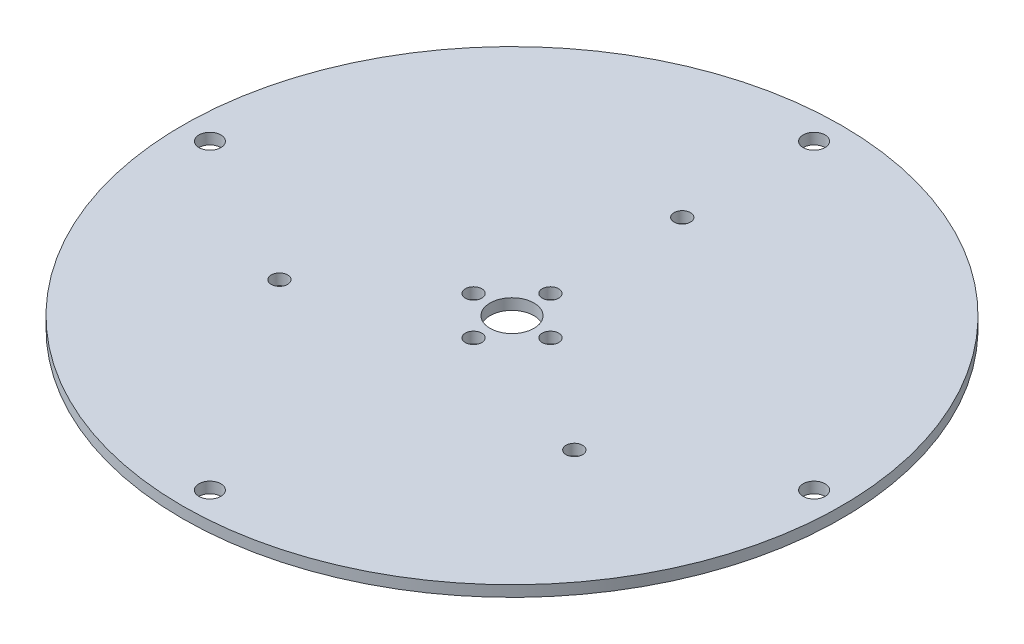
ISO-10303-21;
HEADER;
FILE_DESCRIPTION(('STEP AP214'),'2;1');
FILE_NAME('part.step','',(''),(''),'','','');
FILE_SCHEMA(('AUTOMOTIVE_DESIGN { 1 0 10303 214 1 1 1 1 }'));
ENDSEC;
DATA;
#1=APPLICATION_CONTEXT('core data for automotive mechanical design processes');
#2=APPLICATION_PROTOCOL_DEFINITION('international standard','automotive_design',2000,#1);
#3=PRODUCT_CONTEXT('',#1,'mechanical');
#4=PRODUCT('Part','Part','',(#3));
#5=PRODUCT_RELATED_PRODUCT_CATEGORY('part','',(#4));
#6=PRODUCT_DEFINITION_FORMATION('','',#4);
#7=PRODUCT_DEFINITION_CONTEXT('part definition',#1,'design');
#8=PRODUCT_DEFINITION('design','',#6,#7);
#9=PRODUCT_DEFINITION_SHAPE('','',#8);
#10=(LENGTH_UNIT() NAMED_UNIT(*) SI_UNIT(.MILLI.,.METRE.));
#11=(NAMED_UNIT(*) PLANE_ANGLE_UNIT() SI_UNIT($,.RADIAN.));
#12=(NAMED_UNIT(*) SI_UNIT($,.STERADIAN.) SOLID_ANGLE_UNIT());
#13=UNCERTAINTY_MEASURE_WITH_UNIT(LENGTH_MEASURE(1.E-05),#10,'distance_accuracy_value','');
#14=(GEOMETRIC_REPRESENTATION_CONTEXT(3) GLOBAL_UNCERTAINTY_ASSIGNED_CONTEXT((#13)) GLOBAL_UNIT_ASSIGNED_CONTEXT((#10,
#11,#12)) REPRESENTATION_CONTEXT('',''));
#15=CARTESIAN_POINT('',(0.,0.,0.));
#16=DIRECTION('',(0.,0.,1.));
#17=DIRECTION('',(1.,0.,0.));
#18=AXIS2_PLACEMENT_3D('',#15,#16,#17);
#19=CARTESIAN_POINT('',(0.,2.,0.));
#20=DIRECTION('',(0.,1.,0.));
#21=DIRECTION('',(0.,0.,1.));
#22=AXIS2_PLACEMENT_3D('',#19,#20,#21);
#23=PLANE('',#22);
#24=CARTESIAN_POINT('',(0.,2.,-55.));
#25=DIRECTION('',(0.,1.,0.));
#26=DIRECTION('',(0.,0.,1.));
#27=AXIS2_PLACEMENT_3D('',#24,#25,#26);
#28=CIRCLE('',#27,2.);
#29=CARTESIAN_POINT('',(0.,2.,-53.));
#30=VERTEX_POINT('',#29);
#31=EDGE_CURVE('E62',#30,#30,#28,.T.);
#32=ORIENTED_EDGE('',*,*,#31,.F.);
#33=EDGE_LOOP('',(#32));
#34=FACE_BOUND('',#33,.T.);
#35=CARTESIAN_POINT('',(55.0000000000016,2.,-1.55309068257925E-12));
#36=DIRECTION('',(0.,1.,0.));
#37=DIRECTION('',(0.,0.,1.));
#38=AXIS2_PLACEMENT_3D('',#35,#36,#37);
#39=CIRCLE('',#38,2.00000000000121);
#40=CARTESIAN_POINT('',(55.0000000000016,2.,1.99999999999966));
#41=VERTEX_POINT('',#40);
#42=EDGE_CURVE('E163',#41,#41,#39,.T.);
#43=ORIENTED_EDGE('',*,*,#42,.F.);
#44=EDGE_LOOP('',(#43));
#45=FACE_BOUND('',#44,.T.);
#46=CARTESIAN_POINT('',(3.10618136515851E-12,2.,55.));
#47=DIRECTION('',(0.,1.,0.));
#48=DIRECTION('',(0.,0.,1.));
#49=AXIS2_PLACEMENT_3D('',#46,#47,#48);
#50=CIRCLE('',#49,2.00000000000334);
#51=CARTESIAN_POINT('',(3.10618136515851E-12,2.,57.0000000000033));
#52=VERTEX_POINT('',#51);
#53=EDGE_CURVE('E167',#52,#52,#50,.T.);
#54=ORIENTED_EDGE('',*,*,#53,.F.);
#55=EDGE_LOOP('',(#54));
#56=FACE_BOUND('',#55,.T.);
#57=CARTESIAN_POINT('',(-54.9999999999985,2.,1.55982623997457E-12));
#58=DIRECTION('',(0.,1.,0.));
#59=DIRECTION('',(0.,0.,1.));
#60=AXIS2_PLACEMENT_3D('',#57,#58,#59);
#61=CIRCLE('',#60,2.0000000000025);
#62=CARTESIAN_POINT('',(-54.9999999999985,2.,2.00000000000406));
#63=VERTEX_POINT('',#62);
#64=EDGE_CURVE('E171',#63,#63,#61,.T.);
#65=ORIENTED_EDGE('',*,*,#64,.F.);
#66=EDGE_LOOP('',(#65));
#67=FACE_BOUND('',#66,.T.);
#68=CARTESIAN_POINT('',(0.,2.,-7.));
#69=DIRECTION('',(0.,1.,0.));
#70=DIRECTION('',(0.,0.,1.));
#71=AXIS2_PLACEMENT_3D('',#68,#69,#70);
#72=CIRCLE('',#71,1.5);
#73=CARTESIAN_POINT('',(0.,2.,-5.5));
#74=VERTEX_POINT('',#73);
#75=EDGE_CURVE('E92',#74,#74,#72,.T.);
#76=ORIENTED_EDGE('',*,*,#75,.F.);
#77=EDGE_LOOP('',(#76));
#78=FACE_BOUND('',#77,.T.);
#79=CARTESIAN_POINT('',(7.0000000000002,2.,-1.97666086873723E-13));
#80=DIRECTION('',(0.,1.,0.));
#81=DIRECTION('',(0.,0.,1.));
#82=AXIS2_PLACEMENT_3D('',#79,#80,#81);
#83=CIRCLE('',#82,1.50000000000015);
#84=CARTESIAN_POINT('',(7.0000000000002,2.,1.49999999999996));
#85=VERTEX_POINT('',#84);
#86=EDGE_CURVE('E100',#85,#85,#83,.T.);
#87=ORIENTED_EDGE('',*,*,#86,.F.);
#88=EDGE_LOOP('',(#87));
#89=FACE_BOUND('',#88,.T.);
#90=CARTESIAN_POINT('',(3.95332173747447E-13,2.,7.));
#91=DIRECTION('',(0.,1.,0.));
#92=DIRECTION('',(0.,0.,1.));
#93=AXIS2_PLACEMENT_3D('',#90,#91,#92);
#94=CIRCLE('',#93,1.50000000000042);
#95=CARTESIAN_POINT('',(3.95332173747447E-13,2.,8.50000000000042));
#96=VERTEX_POINT('',#95);
#97=EDGE_CURVE('E83',#96,#96,#94,.T.);
#98=ORIENTED_EDGE('',*,*,#97,.F.);
#99=EDGE_LOOP('',(#98));
#100=FACE_BOUND('',#99,.T.);
#101=CARTESIAN_POINT('',(-6.9999999999998,2.,1.98523339633126E-13));
#102=DIRECTION('',(0.,1.,0.));
#103=DIRECTION('',(0.,0.,1.));
#104=AXIS2_PLACEMENT_3D('',#101,#102,#103);
#105=CIRCLE('',#104,1.50000000000032);
#106=CARTESIAN_POINT('',(-6.9999999999998,2.,1.50000000000052));
#107=VERTEX_POINT('',#106);
#108=EDGE_CURVE('E72',#107,#107,#105,.T.);
#109=ORIENTED_EDGE('',*,*,#108,.F.);
#110=EDGE_LOOP('',(#109));
#111=FACE_BOUND('',#110,.T.);
#112=CARTESIAN_POINT('',(0.,2.,0.));
#113=DIRECTION('',(0.,1.,0.));
#114=DIRECTION('',(0.,0.,1.));
#115=AXIS2_PLACEMENT_3D('',#112,#113,#114);
#116=CIRCLE('',#115,4.);
#117=CARTESIAN_POINT('',(0.,2.,4.));
#118=VERTEX_POINT('',#117);
#119=EDGE_CURVE('E91',#118,#118,#116,.T.);
#120=ORIENTED_EDGE('',*,*,#119,.F.);
#121=EDGE_LOOP('',(#120));
#122=FACE_BOUND('',#121,.T.);
#123=CARTESIAN_POINT('',(26.8467875173196,2.,15.4999999999988));
#124=DIRECTION('',(0.,1.,0.));
#125=DIRECTION('',(0.,0.,1.));
#126=AXIS2_PLACEMENT_3D('',#123,#124,#125);
#127=CIRCLE('',#126,1.50000000000172);
#128=CARTESIAN_POINT('',(26.8467875173196,2.,17.0000000000006));
#129=VERTEX_POINT('',#128);
#130=EDGE_CURVE('E121',#129,#129,#127,.T.);
#131=ORIENTED_EDGE('',*,*,#130,.F.);
#132=EDGE_LOOP('',(#131));
#133=FACE_BOUND('',#132,.T.);
#134=CARTESIAN_POINT('',(0.,2.,0.));
#135=DIRECTION('',(0.,1.,0.));
#136=DIRECTION('',(0.,0.,1.));
#137=AXIS2_PLACEMENT_3D('',#134,#135,#136);
#138=CIRCLE('',#137,60.);
#139=CARTESIAN_POINT('',(0.,2.,60.));
#140=VERTEX_POINT('',#139);
#141=EDGE_CURVE('E10',#140,#140,#138,.T.);
#142=ORIENTED_EDGE('',*,*,#141,.T.);
#143=EDGE_LOOP('',(#142));
#144=FACE_BOUND('',#143,.T.);
#145=CARTESIAN_POINT('',(0.,2.,-31.));
#146=DIRECTION('',(0.,1.,0.));
#147=DIRECTION('',(0.,0.,1.));
#148=AXIS2_PLACEMENT_3D('',#145,#146,#147);
#149=CIRCLE('',#148,1.5);
#150=CARTESIAN_POINT('',(0.,2.,-29.5));
#151=VERTEX_POINT('',#150);
#152=EDGE_CURVE('E51',#151,#151,#149,.T.);
#153=ORIENTED_EDGE('',*,*,#152,.F.);
#154=EDGE_LOOP('',(#153));
#155=FACE_BOUND('',#154,.T.);
#156=CARTESIAN_POINT('',(-26.8467875173156,2.,15.5000000000012));
#157=DIRECTION('',(0.,1.,0.));
#158=DIRECTION('',(0.,0.,1.));
#159=AXIS2_PLACEMENT_3D('',#156,#157,#158);
#160=CIRCLE('',#159,1.50000000000251);
#161=CARTESIAN_POINT('',(-26.8467875173156,2.,17.0000000000037));
#162=VERTEX_POINT('',#161);
#163=EDGE_CURVE('E113',#162,#162,#160,.T.);
#164=ORIENTED_EDGE('',*,*,#163,.F.);
#165=EDGE_LOOP('',(#164));
#166=FACE_BOUND('',#165,.T.);
#167=ADVANCED_FACE('F36',(#34,#45,#56,#67,#78,#89,#100,#111,#122,#133,#144,#155,#166),#23,.T.);
#168=CARTESIAN_POINT('',(0.,0.,0.));
#169=DIRECTION('',(0.,1.,0.));
#170=DIRECTION('',(0.,0.,1.));
#171=AXIS2_PLACEMENT_3D('',#168,#169,#170);
#172=PLANE('',#171);
#173=CARTESIAN_POINT('',(0.,0.,-55.));
#174=DIRECTION('',(0.,1.,0.));
#175=DIRECTION('',(0.,0.,1.));
#176=AXIS2_PLACEMENT_3D('',#173,#174,#175);
#177=CIRCLE('',#176,2.);
#178=CARTESIAN_POINT('',(0.,0.,-53.));
#179=VERTEX_POINT('',#178);
#180=EDGE_CURVE('E40',#179,#179,#177,.T.);
#181=ORIENTED_EDGE('',*,*,#180,.T.);
#182=EDGE_LOOP('',(#181));
#183=FACE_BOUND('',#182,.T.);
#184=CARTESIAN_POINT('',(55.0000000000016,0.,-1.55309068257925E-12));
#185=DIRECTION('',(0.,1.,0.));
#186=DIRECTION('',(0.,0.,1.));
#187=AXIS2_PLACEMENT_3D('',#184,#185,#186);
#188=CIRCLE('',#187,2.00000000000121);
#189=CARTESIAN_POINT('',(55.0000000000016,0.,1.99999999999966));
#190=VERTEX_POINT('',#189);
#191=EDGE_CURVE('E65',#190,#190,#188,.T.);
#192=ORIENTED_EDGE('',*,*,#191,.T.);
#193=EDGE_LOOP('',(#192));
#194=FACE_BOUND('',#193,.T.);
#195=CARTESIAN_POINT('',(3.10618136515851E-12,0.,55.));
#196=DIRECTION('',(0.,1.,0.));
#197=DIRECTION('',(0.,0.,1.));
#198=AXIS2_PLACEMENT_3D('',#195,#196,#197);
#199=CIRCLE('',#198,2.00000000000334);
#200=CARTESIAN_POINT('',(3.10618136515851E-12,0.,57.0000000000033));
#201=VERTEX_POINT('',#200);
#202=EDGE_CURVE('E61',#201,#201,#199,.T.);
#203=ORIENTED_EDGE('',*,*,#202,.T.);
#204=EDGE_LOOP('',(#203));
#205=FACE_BOUND('',#204,.T.);
#206=CARTESIAN_POINT('',(-54.9999999999985,0.,1.55982623997457E-12));
#207=DIRECTION('',(0.,1.,0.));
#208=DIRECTION('',(0.,0.,1.));
#209=AXIS2_PLACEMENT_3D('',#206,#207,#208);
#210=CIRCLE('',#209,2.0000000000025);
#211=CARTESIAN_POINT('',(-54.9999999999985,0.,2.00000000000406));
#212=VERTEX_POINT('',#211);
#213=EDGE_CURVE('E57',#212,#212,#210,.T.);
#214=ORIENTED_EDGE('',*,*,#213,.T.);
#215=EDGE_LOOP('',(#214));
#216=FACE_BOUND('',#215,.T.);
#217=CARTESIAN_POINT('',(0.,0.,-7.));
#218=DIRECTION('',(0.,1.,0.));
#219=DIRECTION('',(0.,0.,1.));
#220=AXIS2_PLACEMENT_3D('',#217,#218,#219);
#221=CIRCLE('',#220,1.5);
#222=CARTESIAN_POINT('',(0.,0.,-5.5));
#223=VERTEX_POINT('',#222);
#224=EDGE_CURVE('E87',#223,#223,#221,.T.);
#225=ORIENTED_EDGE('',*,*,#224,.T.);
#226=EDGE_LOOP('',(#225));
#227=FACE_BOUND('',#226,.T.);
#228=CARTESIAN_POINT('',(7.0000000000002,0.,-1.97666086873723E-13));
#229=DIRECTION('',(0.,1.,0.));
#230=DIRECTION('',(0.,0.,1.));
#231=AXIS2_PLACEMENT_3D('',#228,#229,#230);
#232=CIRCLE('',#231,1.50000000000015);
#233=CARTESIAN_POINT('',(7.0000000000002,0.,1.49999999999996));
#234=VERTEX_POINT('',#233);
#235=EDGE_CURVE('E96',#234,#234,#232,.T.);
#236=ORIENTED_EDGE('',*,*,#235,.T.);
#237=EDGE_LOOP('',(#236));
#238=FACE_BOUND('',#237,.T.);
#239=CARTESIAN_POINT('',(3.95332173747447E-13,0.,7.));
#240=DIRECTION('',(0.,1.,0.));
#241=DIRECTION('',(0.,0.,1.));
#242=AXIS2_PLACEMENT_3D('',#239,#240,#241);
#243=CIRCLE('',#242,1.50000000000042);
#244=CARTESIAN_POINT('',(3.95332173747447E-13,0.,8.50000000000042));
#245=VERTEX_POINT('',#244);
#246=EDGE_CURVE('E104',#245,#245,#243,.T.);
#247=ORIENTED_EDGE('',*,*,#246,.T.);
#248=EDGE_LOOP('',(#247));
#249=FACE_BOUND('',#248,.T.);
#250=CARTESIAN_POINT('',(-6.9999999999998,0.,1.98523339633126E-13));
#251=DIRECTION('',(0.,1.,0.));
#252=DIRECTION('',(0.,0.,1.));
#253=AXIS2_PLACEMENT_3D('',#250,#251,#252);
#254=CIRCLE('',#253,1.50000000000032);
#255=CARTESIAN_POINT('',(-6.9999999999998,0.,1.50000000000052));
#256=VERTEX_POINT('',#255);
#257=EDGE_CURVE('E77',#256,#256,#254,.T.);
#258=ORIENTED_EDGE('',*,*,#257,.T.);
#259=EDGE_LOOP('',(#258));
#260=FACE_BOUND('',#259,.T.);
#261=CARTESIAN_POINT('',(0.,0.,0.));
#262=DIRECTION('',(0.,1.,0.));
#263=DIRECTION('',(0.,0.,1.));
#264=AXIS2_PLACEMENT_3D('',#261,#262,#263);
#265=CIRCLE('',#264,4.);
#266=CARTESIAN_POINT('',(0.,0.,4.));
#267=VERTEX_POINT('',#266);
#268=EDGE_CURVE('E105',#267,#267,#265,.T.);
#269=ORIENTED_EDGE('',*,*,#268,.T.);
#270=EDGE_LOOP('',(#269));
#271=FACE_BOUND('',#270,.T.);
#272=CARTESIAN_POINT('',(0.,0.,0.));
#273=DIRECTION('',(0.,1.,0.));
#274=DIRECTION('',(0.,0.,1.));
#275=AXIS2_PLACEMENT_3D('',#272,#273,#274);
#276=CIRCLE('',#275,60.);
#277=CARTESIAN_POINT('',(0.,0.,60.));
#278=VERTEX_POINT('',#277);
#279=EDGE_CURVE('E45',#278,#278,#276,.T.);
#280=ORIENTED_EDGE('',*,*,#279,.F.);
#281=EDGE_LOOP('',(#280));
#282=FACE_BOUND('',#281,.T.);
#283=CARTESIAN_POINT('',(0.,0.,-31.));
#284=DIRECTION('',(0.,1.,0.));
#285=DIRECTION('',(0.,0.,1.));
#286=AXIS2_PLACEMENT_3D('',#283,#284,#285);
#287=CIRCLE('',#286,1.5);
#288=CARTESIAN_POINT('',(0.,0.,-29.5));
#289=VERTEX_POINT('',#288);
#290=EDGE_CURVE('E54',#289,#289,#287,.T.);
#291=ORIENTED_EDGE('',*,*,#290,.T.);
#292=EDGE_LOOP('',(#291));
#293=FACE_BOUND('',#292,.T.);
#294=CARTESIAN_POINT('',(26.8467875173196,0.,15.4999999999988));
#295=DIRECTION('',(0.,1.,0.));
#296=DIRECTION('',(0.,0.,1.));
#297=AXIS2_PLACEMENT_3D('',#294,#295,#296);
#298=CIRCLE('',#297,1.50000000000172);
#299=CARTESIAN_POINT('',(26.8467875173196,0.,17.0000000000006));
#300=VERTEX_POINT('',#299);
#301=EDGE_CURVE('E117',#300,#300,#298,.T.);
#302=ORIENTED_EDGE('',*,*,#301,.T.);
#303=EDGE_LOOP('',(#302));
#304=FACE_BOUND('',#303,.T.);
#305=CARTESIAN_POINT('',(-26.8467875173156,0.,15.5000000000012));
#306=DIRECTION('',(0.,1.,0.));
#307=DIRECTION('',(0.,0.,1.));
#308=AXIS2_PLACEMENT_3D('',#305,#306,#307);
#309=CIRCLE('',#308,1.50000000000251);
#310=CARTESIAN_POINT('',(-26.8467875173156,0.,17.0000000000037));
#311=VERTEX_POINT('',#310);
#312=EDGE_CURVE('E109',#311,#311,#309,.T.);
#313=ORIENTED_EDGE('',*,*,#312,.T.);
#314=EDGE_LOOP('',(#313));
#315=FACE_BOUND('',#314,.T.);
#316=ADVANCED_FACE('F135',(#183,#194,#205,#216,#227,#238,#249,#260,#271,#282,#293,#304,#315),
#172,.F.);
#317=CARTESIAN_POINT('',(0.,2.,0.));
#318=DIRECTION('',(0.,-1.,0.));
#319=DIRECTION('',(0.,0.,-1.));
#320=AXIS2_PLACEMENT_3D('',#317,#318,#319);
#321=CYLINDRICAL_SURFACE('',#320,60.);
#322=ORIENTED_EDGE('',*,*,#141,.F.);
#323=EDGE_LOOP('',(#322));
#324=FACE_BOUND('',#323,.T.);
#325=ORIENTED_EDGE('',*,*,#279,.T.);
#326=EDGE_LOOP('',(#325));
#327=FACE_BOUND('',#326,.T.);
#328=ADVANCED_FACE('F38',(#324,#327),#321,.T.);
#329=CARTESIAN_POINT('',(0.,2.,-31.));
#330=DIRECTION('',(0.,-1.,0.));
#331=DIRECTION('',(0.,0.,-1.));
#332=AXIS2_PLACEMENT_3D('',#329,#330,#331);
#333=CYLINDRICAL_SURFACE('',#332,1.5);
#334=ORIENTED_EDGE('',*,*,#152,.T.);
#335=EDGE_LOOP('',(#334));
#336=FACE_BOUND('',#335,.T.);
#337=ORIENTED_EDGE('',*,*,#290,.F.);
#338=EDGE_LOOP('',(#337));
#339=FACE_BOUND('',#338,.T.);
#340=ADVANCED_FACE('F138',(#336,#339),#333,.F.);
#341=CARTESIAN_POINT('',(26.8467875173196,2.,15.4999999999988));
#342=DIRECTION('',(0.,-1.,0.));
#343=DIRECTION('',(0.,0.,-1.));
#344=AXIS2_PLACEMENT_3D('',#341,#342,#343);
#345=CYLINDRICAL_SURFACE('',#344,1.50000000000172);
#346=ORIENTED_EDGE('',*,*,#130,.T.);
#347=EDGE_LOOP('',(#346));
#348=FACE_BOUND('',#347,.T.);
#349=ORIENTED_EDGE('',*,*,#301,.F.);
#350=EDGE_LOOP('',(#349));
#351=FACE_BOUND('',#350,.T.);
#352=ADVANCED_FACE('F140',(#348,#351),#345,.F.);
#353=CARTESIAN_POINT('',(-26.8467875173156,2.,15.5000000000012));
#354=DIRECTION('',(0.,-1.,0.));
#355=DIRECTION('',(0.,0.,-1.));
#356=AXIS2_PLACEMENT_3D('',#353,#354,#355);
#357=CYLINDRICAL_SURFACE('',#356,1.50000000000251);
#358=ORIENTED_EDGE('',*,*,#163,.T.);
#359=EDGE_LOOP('',(#358));
#360=FACE_BOUND('',#359,.T.);
#361=ORIENTED_EDGE('',*,*,#312,.F.);
#362=EDGE_LOOP('',(#361));
#363=FACE_BOUND('',#362,.T.);
#364=ADVANCED_FACE('F146',(#360,#363),#357,.F.);
#365=CARTESIAN_POINT('',(0.,0.,0.));
#366=DIRECTION('',(0.,1.,0.));
#367=DIRECTION('',(0.,0.,1.));
#368=AXIS2_PLACEMENT_3D('',#365,#366,#367);
#369=CYLINDRICAL_SURFACE('',#368,4.);
#370=ORIENTED_EDGE('',*,*,#268,.F.);
#371=EDGE_LOOP('',(#370));
#372=FACE_BOUND('',#371,.T.);
#373=ORIENTED_EDGE('',*,*,#119,.T.);
#374=EDGE_LOOP('',(#373));
#375=FACE_BOUND('',#374,.T.);
#376=ADVANCED_FACE('F189',(#372,#375),#369,.F.);
#377=CARTESIAN_POINT('',(-6.9999999999998,0.,1.98523339633126E-13));
#378=DIRECTION('',(0.,1.,0.));
#379=DIRECTION('',(0.,0.,1.));
#380=AXIS2_PLACEMENT_3D('',#377,#378,#379);
#381=CYLINDRICAL_SURFACE('',#380,1.50000000000032);
#382=ORIENTED_EDGE('',*,*,#257,.F.);
#383=EDGE_LOOP('',(#382));
#384=FACE_BOUND('',#383,.T.);
#385=ORIENTED_EDGE('',*,*,#108,.T.);
#386=EDGE_LOOP('',(#385));
#387=FACE_BOUND('',#386,.T.);
#388=ADVANCED_FACE('F196',(#384,#387),#381,.F.);
#389=CARTESIAN_POINT('',(3.95332173747447E-13,0.,7.));
#390=DIRECTION('',(0.,1.,0.));
#391=DIRECTION('',(0.,0.,1.));
#392=AXIS2_PLACEMENT_3D('',#389,#390,#391);
#393=CYLINDRICAL_SURFACE('',#392,1.50000000000042);
#394=ORIENTED_EDGE('',*,*,#246,.F.);
#395=EDGE_LOOP('',(#394));
#396=FACE_BOUND('',#395,.T.);
#397=ORIENTED_EDGE('',*,*,#97,.T.);
#398=EDGE_LOOP('',(#397));
#399=FACE_BOUND('',#398,.T.);
#400=ADVANCED_FACE('F204',(#396,#399),#393,.F.);
#401=CARTESIAN_POINT('',(7.0000000000002,0.,-1.97666086873723E-13));
#402=DIRECTION('',(0.,1.,0.));
#403=DIRECTION('',(0.,0.,1.));
#404=AXIS2_PLACEMENT_3D('',#401,#402,#403);
#405=CYLINDRICAL_SURFACE('',#404,1.50000000000015);
#406=ORIENTED_EDGE('',*,*,#235,.F.);
#407=EDGE_LOOP('',(#406));
#408=FACE_BOUND('',#407,.T.);
#409=ORIENTED_EDGE('',*,*,#86,.T.);
#410=EDGE_LOOP('',(#409));
#411=FACE_BOUND('',#410,.T.);
#412=ADVANCED_FACE('F200',(#408,#411),#405,.F.);
#413=CARTESIAN_POINT('',(0.,0.,-7.));
#414=DIRECTION('',(0.,1.,0.));
#415=DIRECTION('',(0.,0.,1.));
#416=AXIS2_PLACEMENT_3D('',#413,#414,#415);
#417=CYLINDRICAL_SURFACE('',#416,1.5);
#418=ORIENTED_EDGE('',*,*,#224,.F.);
#419=EDGE_LOOP('',(#418));
#420=FACE_BOUND('',#419,.T.);
#421=ORIENTED_EDGE('',*,*,#75,.T.);
#422=EDGE_LOOP('',(#421));
#423=FACE_BOUND('',#422,.T.);
#424=ADVANCED_FACE('F203',(#420,#423),#417,.F.);
#425=CARTESIAN_POINT('',(-54.9999999999985,-8.,1.55982623997457E-12));
#426=DIRECTION('',(0.,1.,0.));
#427=DIRECTION('',(0.,0.,1.));
#428=AXIS2_PLACEMENT_3D('',#425,#426,#427);
#429=CYLINDRICAL_SURFACE('',#428,2.0000000000025);
#430=ORIENTED_EDGE('',*,*,#64,.T.);
#431=EDGE_LOOP('',(#430));
#432=FACE_BOUND('',#431,.T.);
#433=ORIENTED_EDGE('',*,*,#213,.F.);
#434=EDGE_LOOP('',(#433));
#435=FACE_BOUND('',#434,.T.);
#436=ADVANCED_FACE('F208',(#432,#435),#429,.F.);
#437=CARTESIAN_POINT('',(3.10618136515851E-12,-8.,55.));
#438=DIRECTION('',(0.,1.,0.));
#439=DIRECTION('',(0.,0.,1.));
#440=AXIS2_PLACEMENT_3D('',#437,#438,#439);
#441=CYLINDRICAL_SURFACE('',#440,2.00000000000334);
#442=ORIENTED_EDGE('',*,*,#53,.T.);
#443=EDGE_LOOP('',(#442));
#444=FACE_BOUND('',#443,.T.);
#445=ORIENTED_EDGE('',*,*,#202,.F.);
#446=EDGE_LOOP('',(#445));
#447=FACE_BOUND('',#446,.T.);
#448=ADVANCED_FACE('F218',(#444,#447),#441,.F.);
#449=CARTESIAN_POINT('',(55.0000000000016,-8.,-1.55309068257925E-12));
#450=DIRECTION('',(0.,1.,0.));
#451=DIRECTION('',(0.,0.,1.));
#452=AXIS2_PLACEMENT_3D('',#449,#450,#451);
#453=CYLINDRICAL_SURFACE('',#452,2.00000000000121);
#454=ORIENTED_EDGE('',*,*,#42,.T.);
#455=EDGE_LOOP('',(#454));
#456=FACE_BOUND('',#455,.T.);
#457=ORIENTED_EDGE('',*,*,#191,.F.);
#458=EDGE_LOOP('',(#457));
#459=FACE_BOUND('',#458,.T.);
#460=ADVANCED_FACE('F222',(#456,#459),#453,.F.);
#461=CARTESIAN_POINT('',(0.,-8.,-55.));
#462=DIRECTION('',(0.,1.,0.));
#463=DIRECTION('',(0.,0.,1.));
#464=AXIS2_PLACEMENT_3D('',#461,#462,#463);
#465=CYLINDRICAL_SURFACE('',#464,2.);
#466=ORIENTED_EDGE('',*,*,#31,.T.);
#467=EDGE_LOOP('',(#466));
#468=FACE_BOUND('',#467,.T.);
#469=ORIENTED_EDGE('',*,*,#180,.F.);
#470=EDGE_LOOP('',(#469));
#471=FACE_BOUND('',#470,.T.);
#472=ADVANCED_FACE('F226',(#468,#471),#465,.F.);
#473=CLOSED_SHELL('',(#167,#316,#328,#340,#352,#364,#376,#388,#400,#412,#424,#436,#448,#460,#472));
#474=MANIFOLD_SOLID_BREP('B2',#473);
#475=ADVANCED_BREP_SHAPE_REPRESENTATION('',(#18,#474),#14);
#476=SHAPE_DEFINITION_REPRESENTATION(#9,#475);
ENDSEC;
END-ISO-10303-21;
